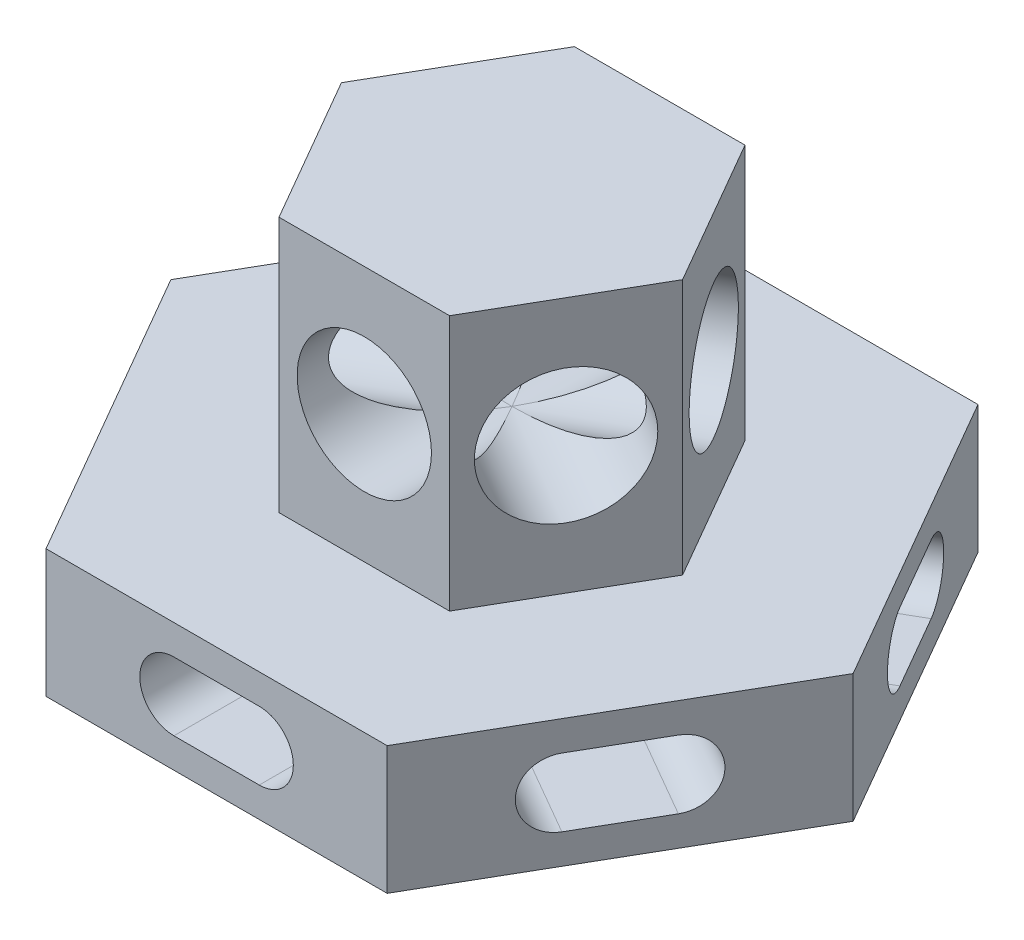
ISO-10303-21;
HEADER;
FILE_DESCRIPTION(('STEP AP214'),'2;1');
FILE_NAME('part.step','',(''),(''),'','','');
FILE_SCHEMA(('AUTOMOTIVE_DESIGN { 1 0 10303 214 1 1 1 1 }'));
ENDSEC;
DATA;
#1=APPLICATION_CONTEXT('core data for automotive mechanical design processes');
#2=APPLICATION_PROTOCOL_DEFINITION('international standard','automotive_design',2000,#1);
#3=PRODUCT_CONTEXT('',#1,'mechanical');
#4=PRODUCT('Part','Part','',(#3));
#5=PRODUCT_RELATED_PRODUCT_CATEGORY('part','',(#4));
#6=PRODUCT_DEFINITION_FORMATION('','',#4);
#7=PRODUCT_DEFINITION_CONTEXT('part definition',#1,'design');
#8=PRODUCT_DEFINITION('design','',#6,#7);
#9=PRODUCT_DEFINITION_SHAPE('','',#8);
#10=(LENGTH_UNIT() NAMED_UNIT(*) SI_UNIT(.MILLI.,.METRE.));
#11=(NAMED_UNIT(*) PLANE_ANGLE_UNIT() SI_UNIT($,.RADIAN.));
#12=(NAMED_UNIT(*) SI_UNIT($,.STERADIAN.) SOLID_ANGLE_UNIT());
#13=UNCERTAINTY_MEASURE_WITH_UNIT(LENGTH_MEASURE(1.E-05),#10,'distance_accuracy_value','');
#14=(GEOMETRIC_REPRESENTATION_CONTEXT(3) GLOBAL_UNCERTAINTY_ASSIGNED_CONTEXT((#13)) GLOBAL_UNIT_ASSIGNED_CONTEXT((#10,
#11,#12)) REPRESENTATION_CONTEXT('',''));
#15=CARTESIAN_POINT('',(0.,0.,0.));
#16=DIRECTION('',(0.,0.,1.));
#17=DIRECTION('',(1.,0.,0.));
#18=AXIS2_PLACEMENT_3D('',#15,#16,#17);
#19=CARTESIAN_POINT('',(-10.,15.,-69.2820323027551));
#20=DIRECTION('',(0.,0.,1.));
#21=DIRECTION('',(1.,0.,0.));
#22=AXIS2_PLACEMENT_3D('',#19,#20,#21);
#23=CYLINDRICAL_SURFACE('',#22,8.);
#24=DIRECTION('',(0.,0.,1.));
#25=VECTOR('',#24,1.);
#26=CARTESIAN_POINT('',(-10.,23.,-69.2820323027551));
#27=LINE('',#26,#25);
#28=CARTESIAN_POINT('',(-10.,23.,-69.2820323027551));
#29=VERTEX_POINT('',#28);
#30=CARTESIAN_POINT('',(-10.,23.,-17.3205080756886));
#31=VERTEX_POINT('',#30);
#32=EDGE_CURVE('E92',#29,#31,#27,.T.);
#33=ORIENTED_EDGE('',*,*,#32,.T.);
#34=CARTESIAN_POINT('',(-10.,15.,-17.3205080756886));
#35=DIRECTION('',(0.866025403784436,0.,-0.500000000000004));
#36=DIRECTION('',(-0.500000000000004,0.,-0.866025403784436));
#37=AXIS2_PLACEMENT_3D('',#34,#35,#36);
#38=ELLIPSE('',#37,15.9999999999999,8.);
#39=CARTESIAN_POINT('',(-9.99999999999994,7.,-17.3205080756887));
#40=VERTEX_POINT('',#39);
#41=EDGE_CURVE('E457',#31,#40,#38,.F.);
#42=ORIENTED_EDGE('',*,*,#41,.T.);
#43=DIRECTION('',(0.,0.,1.));
#44=VECTOR('',#43,1.);
#45=CARTESIAN_POINT('',(-10.,7.,-69.2820323027551));
#46=LINE('',#45,#44);
#47=CARTESIAN_POINT('',(-10.,7.,-69.2820323027551));
#48=VERTEX_POINT('',#47);
#49=EDGE_CURVE('E136',#48,#40,#46,.T.);
#50=ORIENTED_EDGE('',*,*,#49,.F.);
#51=CARTESIAN_POINT('',(-10.,15.,-69.2820323027551));
#52=DIRECTION('',(0.,0.,1.));
#53=DIRECTION('',(1.,0.,0.));
#54=AXIS2_PLACEMENT_3D('',#51,#52,#53);
#55=CIRCLE('',#54,8.);
#56=EDGE_CURVE('E152',#29,#48,#55,.T.);
#57=ORIENTED_EDGE('',*,*,#56,.F.);
#58=EDGE_LOOP('',(#33,#42,#50,#57));
#59=FACE_BOUND('',#58,.T.);
#60=ADVANCED_FACE('F45',(#59),#23,.F.);
#61=CARTESIAN_POINT('',(10.,15.,-69.2820323027551));
#62=DIRECTION('',(0.,0.,1.));
#63=DIRECTION('',(1.,0.,0.));
#64=AXIS2_PLACEMENT_3D('',#61,#62,#63);
#65=CYLINDRICAL_SURFACE('',#64,8.);
#66=DIRECTION('',(0.,0.,1.));
#67=VECTOR('',#66,1.);
#68=CARTESIAN_POINT('',(10.,23.,-69.2820323027551));
#69=LINE('',#68,#67);
#70=CARTESIAN_POINT('',(10.,23.,17.3205080756886));
#71=VERTEX_POINT('',#70);
#72=CARTESIAN_POINT('',(10.,23.,69.2820323027551));
#73=VERTEX_POINT('',#72);
#74=EDGE_CURVE('E199',#71,#73,#69,.T.);
#75=ORIENTED_EDGE('',*,*,#74,.F.);
#76=CARTESIAN_POINT('',(9.99999999999999,15.,17.3205080756886));
#77=DIRECTION('',(0.866025403784436,0.,-0.500000000000004));
#78=DIRECTION('',(-0.500000000000004,0.,-0.866025403784436));
#79=AXIS2_PLACEMENT_3D('',#76,#77,#78);
#80=ELLIPSE('',#79,15.9999999999999,8.);
#81=CARTESIAN_POINT('',(9.99999999999994,7.,17.3205080756887));
#82=VERTEX_POINT('',#81);
#83=EDGE_CURVE('E690',#71,#82,#80,.T.);
#84=ORIENTED_EDGE('',*,*,#83,.T.);
#85=DIRECTION('',(0.,0.,1.));
#86=VECTOR('',#85,1.);
#87=CARTESIAN_POINT('',(10.,7.,-69.2820323027551));
#88=LINE('',#87,#86);
#89=CARTESIAN_POINT('',(10.,7.,69.2820323027551));
#90=VERTEX_POINT('',#89);
#91=EDGE_CURVE('E100',#82,#90,#88,.T.);
#92=ORIENTED_EDGE('',*,*,#91,.T.);
#93=CARTESIAN_POINT('',(10.,15.,69.2820323027551));
#94=DIRECTION('',(0.,0.,1.));
#95=DIRECTION('',(1.,0.,0.));
#96=AXIS2_PLACEMENT_3D('',#93,#94,#95);
#97=CIRCLE('',#96,8.);
#98=EDGE_CURVE('E408',#90,#73,#97,.T.);
#99=ORIENTED_EDGE('',*,*,#98,.T.);
#100=EDGE_LOOP('',(#75,#84,#92,#99));
#101=FACE_BOUND('',#100,.T.);
#102=ADVANCED_FACE('F639',(#101),#65,.F.);
#103=CARTESIAN_POINT('',(0.,60.,34.6410161513775));
#104=DIRECTION('',(0.,0.,1.));
#105=DIRECTION('',(1.,0.,0.));
#106=AXIS2_PLACEMENT_3D('',#103,#104,#105);
#107=CYLINDRICAL_SURFACE('',#106,15.75);
#108=CARTESIAN_POINT('',(0.,60.,34.6410161513775));
#109=DIRECTION('',(0.,0.,1.));
#110=DIRECTION('',(1.,0.,0.));
#111=AXIS2_PLACEMENT_3D('',#108,#109,#110);
#112=CIRCLE('',#111,15.75);
#113=CARTESIAN_POINT('',(15.75,60.,34.6410161513775));
#114=VERTEX_POINT('',#113);
#115=EDGE_CURVE('E240',#114,#114,#112,.T.);
#116=ORIENTED_EDGE('',*,*,#115,.T.);
#117=EDGE_LOOP('',(#116));
#118=FACE_BOUND('',#117,.T.);
#119=CARTESIAN_POINT('',(0.,60.,0.));
#120=DIRECTION('',(-0.866025403784438,0.,0.500000000000001));
#121=DIRECTION('',(0.500000000000001,0.,0.866025403784438));
#122=AXIS2_PLACEMENT_3D('',#119,#120,#121);
#123=ELLIPSE('',#122,31.5,15.75);
#124=CARTESIAN_POINT('',(0.,75.75,0.));
#125=VERTEX_POINT('',#124);
#126=CARTESIAN_POINT('',(0.,44.25,0.));
#127=VERTEX_POINT('',#126);
#128=EDGE_CURVE('E392',#125,#127,#123,.F.);
#129=ORIENTED_EDGE('',*,*,#128,.T.);
#130=CARTESIAN_POINT('',(0.,60.,0.));
#131=DIRECTION('',(0.86602540378444,0.,0.499999999999998));
#132=DIRECTION('',(-0.499999999999998,0.,0.86602540378444));
#133=AXIS2_PLACEMENT_3D('',#130,#131,#132);
#134=ELLIPSE('',#133,31.5000000000001,15.75);
#135=EDGE_CURVE('E224',#127,#125,#134,.F.);
#136=ORIENTED_EDGE('',*,*,#135,.T.);
#137=EDGE_LOOP('',(#129,#136));
#138=FACE_BOUND('',#137,.T.);
#139=ADVANCED_FACE('F571',(#118,#138),#107,.F.);
#140=CARTESIAN_POINT('',(-40.,30.,69.2820323027551));
#141=DIRECTION('',(0.,0.,-1.));
#142=DIRECTION('',(-1.,0.,0.));
#143=AXIS2_PLACEMENT_3D('',#140,#141,#142);
#144=PLANE('',#143);
#145=DIRECTION('',(1.,0.,0.));
#146=VECTOR('',#145,1.);
#147=CARTESIAN_POINT('',(-10.,7.,69.2820323027551));
#148=LINE('',#147,#146);
#149=CARTESIAN_POINT('',(-10.,7.,69.2820323027551));
#150=VERTEX_POINT('',#149);
#151=EDGE_CURVE('E405',#150,#90,#148,.T.);
#152=ORIENTED_EDGE('',*,*,#151,.F.);
#153=CARTESIAN_POINT('',(-10.,15.,69.2820323027551));
#154=DIRECTION('',(0.,0.,1.));
#155=DIRECTION('',(1.,0.,0.));
#156=AXIS2_PLACEMENT_3D('',#153,#154,#155);
#157=CIRCLE('',#156,8.);
#158=CARTESIAN_POINT('',(-10.,23.,69.2820323027551));
#159=VERTEX_POINT('',#158);
#160=EDGE_CURVE('E216',#159,#150,#157,.T.);
#161=ORIENTED_EDGE('',*,*,#160,.F.);
#162=DIRECTION('',(1.,0.,0.));
#163=VECTOR('',#162,1.);
#164=CARTESIAN_POINT('',(-10.,23.,69.2820323027551));
#165=LINE('',#164,#163);
#166=EDGE_CURVE('E411',#73,#159,#165,.F.);
#167=ORIENTED_EDGE('',*,*,#166,.F.);
#168=ORIENTED_EDGE('',*,*,#98,.F.);
#169=EDGE_LOOP('',(#152,#161,#167,#168));
#170=FACE_BOUND('',#169,.T.);
#171=DIRECTION('',(1.,0.,0.));
#172=VECTOR('',#171,1.);
#173=CARTESIAN_POINT('',(-40.,0.,69.2820323027551));
#174=LINE('',#173,#172);
#175=CARTESIAN_POINT('',(-40.,0.,69.2820323027551));
#176=VERTEX_POINT('',#175);
#177=CARTESIAN_POINT('',(40.,0.,69.2820323027551));
#178=VERTEX_POINT('',#177);
#179=EDGE_CURVE('E320',#176,#178,#174,.T.);
#180=ORIENTED_EDGE('',*,*,#179,.T.);
#181=DIRECTION('',(0.,-1.,0.));
#182=VECTOR('',#181,1.);
#183=CARTESIAN_POINT('',(40.,30.,69.2820323027551));
#184=LINE('',#183,#182);
#185=CARTESIAN_POINT('',(40.,30.,69.2820323027551));
#186=VERTEX_POINT('',#185);
#187=EDGE_CURVE('E388',#186,#178,#184,.T.);
#188=ORIENTED_EDGE('',*,*,#187,.F.);
#189=DIRECTION('',(1.,0.,0.));
#190=VECTOR('',#189,1.);
#191=CARTESIAN_POINT('',(-40.,30.,69.2820323027551));
#192=LINE('',#191,#190);
#193=CARTESIAN_POINT('',(-40.,30.,69.2820323027551));
#194=VERTEX_POINT('',#193);
#195=EDGE_CURVE('E321',#194,#186,#192,.T.);
#196=ORIENTED_EDGE('',*,*,#195,.F.);
#197=DIRECTION('',(0.,-1.,0.));
#198=VECTOR('',#197,1.);
#199=CARTESIAN_POINT('',(-40.,30.,69.2820323027551));
#200=LINE('',#199,#198);
#201=EDGE_CURVE('E346',#194,#176,#200,.T.);
#202=ORIENTED_EDGE('',*,*,#201,.T.);
#203=EDGE_LOOP('',(#180,#188,#196,#202));
#204=FACE_BOUND('',#203,.T.);
#205=ADVANCED_FACE('F47',(#170,#204),#144,.F.);
#206=CARTESIAN_POINT('',(40.,30.,69.2820323027551));
#207=DIRECTION('',(-0.866025403784439,0.,-0.5));
#208=DIRECTION('',(-0.5,0.,0.866025403784439));
#209=AXIS2_PLACEMENT_3D('',#206,#207,#208);
#210=PLANE('',#209);
#211=CARTESIAN_POINT('',(55.0000000000001,15.,43.3012701892218));
#212=DIRECTION('',(-0.866025403784439,0.,-0.5));
#213=DIRECTION('',(-0.5,0.,0.866025403784439));
#214=AXIS2_PLACEMENT_3D('',#211,#212,#213);
#215=CIRCLE('',#214,8.);
#216=CARTESIAN_POINT('',(55.,7.,43.3012701892218));
#217=VERTEX_POINT('',#216);
#218=CARTESIAN_POINT('',(55.,23.,43.3012701892218));
#219=VERTEX_POINT('',#218);
#220=EDGE_CURVE('E192',#217,#219,#215,.T.);
#221=ORIENTED_EDGE('',*,*,#220,.T.);
#222=DIRECTION('',(0.5,0.,-0.866025403784439));
#223=VECTOR('',#222,1.);
#224=CARTESIAN_POINT('',(40.,23.,69.2820323027551));
#225=LINE('',#224,#223);
#226=CARTESIAN_POINT('',(65.0000000000001,23.,25.980762113533));
#227=VERTEX_POINT('',#226);
#228=EDGE_CURVE('E188',#219,#227,#225,.T.);
#229=ORIENTED_EDGE('',*,*,#228,.T.);
#230=CARTESIAN_POINT('',(65.,15.,25.980762113533));
#231=DIRECTION('',(-0.866025403784439,0.,-0.5));
#232=DIRECTION('',(-0.5,0.,0.866025403784439));
#233=AXIS2_PLACEMENT_3D('',#230,#231,#232);
#234=CIRCLE('',#233,8.);
#235=CARTESIAN_POINT('',(65.0000000000001,7.,25.980762113533));
#236=VERTEX_POINT('',#235);
#237=EDGE_CURVE('E11',#227,#236,#234,.T.);
#238=ORIENTED_EDGE('',*,*,#237,.T.);
#239=DIRECTION('',(-0.5,0.,0.866025403784439));
#240=VECTOR('',#239,1.);
#241=CARTESIAN_POINT('',(40.,7.,69.2820323027551));
#242=LINE('',#241,#240);
#243=EDGE_CURVE('E167',#236,#217,#242,.T.);
#244=ORIENTED_EDGE('',*,*,#243,.T.);
#245=EDGE_LOOP('',(#221,#229,#238,#244));
#246=FACE_BOUND('',#245,.T.);
#247=DIRECTION('',(0.5,0.,-0.866025403784439));
#248=VECTOR('',#247,1.);
#249=CARTESIAN_POINT('',(40.,0.,69.2820323027551));
#250=LINE('',#249,#248);
#251=CARTESIAN_POINT('',(80.,0.,0.));
#252=VERTEX_POINT('',#251);
#253=EDGE_CURVE('E350',#178,#252,#250,.T.);
#254=ORIENTED_EDGE('',*,*,#253,.T.);
#255=DIRECTION('',(0.,-1.,0.));
#256=VECTOR('',#255,1.);
#257=CARTESIAN_POINT('',(80.,30.,0.));
#258=LINE('',#257,#256);
#259=CARTESIAN_POINT('',(80.,30.,0.));
#260=VERTEX_POINT('',#259);
#261=EDGE_CURVE('E384',#260,#252,#258,.T.);
#262=ORIENTED_EDGE('',*,*,#261,.F.);
#263=DIRECTION('',(0.5,0.,-0.866025403784439));
#264=VECTOR('',#263,1.);
#265=CARTESIAN_POINT('',(40.,30.,69.2820323027551));
#266=LINE('',#265,#264);
#267=EDGE_CURVE('E325',#186,#260,#266,.T.);
#268=ORIENTED_EDGE('',*,*,#267,.F.);
#269=ORIENTED_EDGE('',*,*,#187,.T.);
#270=EDGE_LOOP('',(#254,#262,#268,#269));
#271=FACE_BOUND('',#270,.T.);
#272=ADVANCED_FACE('F742',(#246,#271),#210,.F.);
#273=CARTESIAN_POINT('',(80.,30.,0.));
#274=DIRECTION('',(-0.866025403784439,0.,0.5));
#275=DIRECTION('',(0.5,0.,0.866025403784439));
#276=AXIS2_PLACEMENT_3D('',#273,#274,#275);
#277=PLANE('',#276);
#278=DIRECTION('',(-0.5,0.,-0.866025403784439));
#279=VECTOR('',#278,1.);
#280=CARTESIAN_POINT('',(80.,23.,0.));
#281=LINE('',#280,#279);
#282=CARTESIAN_POINT('',(64.9999999999998,23.,-25.9807621135334));
#283=VERTEX_POINT('',#282);
#284=CARTESIAN_POINT('',(54.9999999999998,23.,-43.3012701892222));
#285=VERTEX_POINT('',#284);
#286=EDGE_CURVE('E184',#283,#285,#281,.T.);
#287=ORIENTED_EDGE('',*,*,#286,.T.);
#288=CARTESIAN_POINT('',(54.9999999999998,15.,-43.3012701892222));
#289=DIRECTION('',(-0.866025403784439,0.,0.5));
#290=DIRECTION('',(0.5,0.,0.866025403784439));
#291=AXIS2_PLACEMENT_3D('',#288,#289,#290);
#292=CIRCLE('',#291,8.);
#293=CARTESIAN_POINT('',(54.9999999999998,7.,-43.3012701892222));
#294=VERTEX_POINT('',#293);
#295=EDGE_CURVE('E170',#285,#294,#292,.T.);
#296=ORIENTED_EDGE('',*,*,#295,.T.);
#297=DIRECTION('',(0.5,0.,0.866025403784439));
#298=VECTOR('',#297,1.);
#299=CARTESIAN_POINT('',(80.,7.,0.));
#300=LINE('',#299,#298);
#301=CARTESIAN_POINT('',(64.9999999999998,7.,-25.9807621135334));
#302=VERTEX_POINT('',#301);
#303=EDGE_CURVE('E161',#294,#302,#300,.T.);
#304=ORIENTED_EDGE('',*,*,#303,.T.);
#305=CARTESIAN_POINT('',(64.9999999999998,15.,-25.9807621135334));
#306=DIRECTION('',(-0.866025403784439,0.,0.5));
#307=DIRECTION('',(0.5,0.,0.866025403784439));
#308=AXIS2_PLACEMENT_3D('',#305,#306,#307);
#309=CIRCLE('',#308,8.);
#310=EDGE_CURVE('E56',#302,#283,#309,.T.);
#311=ORIENTED_EDGE('',*,*,#310,.T.);
#312=EDGE_LOOP('',(#287,#296,#304,#311));
#313=FACE_BOUND('',#312,.T.);
#314=DIRECTION('',(-0.5,0.,-0.866025403784439));
#315=VECTOR('',#314,1.);
#316=CARTESIAN_POINT('',(80.,0.,0.));
#317=LINE('',#316,#315);
#318=CARTESIAN_POINT('',(40.,0.,-69.2820323027551));
#319=VERTEX_POINT('',#318);
#320=EDGE_CURVE('E354',#252,#319,#317,.T.);
#321=ORIENTED_EDGE('',*,*,#320,.T.);
#322=DIRECTION('',(0.,-1.,0.));
#323=VECTOR('',#322,1.);
#324=CARTESIAN_POINT('',(40.,30.,-69.2820323027551));
#325=LINE('',#324,#323);
#326=CARTESIAN_POINT('',(40.,30.,-69.2820323027551));
#327=VERTEX_POINT('',#326);
#328=EDGE_CURVE('E380',#327,#319,#325,.T.);
#329=ORIENTED_EDGE('',*,*,#328,.F.);
#330=DIRECTION('',(-0.5,0.,-0.866025403784439));
#331=VECTOR('',#330,1.);
#332=CARTESIAN_POINT('',(80.,30.,0.));
#333=LINE('',#332,#331);
#334=EDGE_CURVE('E330',#260,#327,#333,.T.);
#335=ORIENTED_EDGE('',*,*,#334,.F.);
#336=ORIENTED_EDGE('',*,*,#261,.T.);
#337=EDGE_LOOP('',(#321,#329,#335,#336));
#338=FACE_BOUND('',#337,.T.);
#339=ADVANCED_FACE('F715',(#313,#338),#277,.F.);
#340=CARTESIAN_POINT('',(40.,30.,-69.2820323027551));
#341=DIRECTION('',(0.,0.,1.));
#342=DIRECTION('',(1.,0.,0.));
#343=AXIS2_PLACEMENT_3D('',#340,#341,#342);
#344=PLANE('',#343);
#345=DIRECTION('',(1.,0.,0.));
#346=VECTOR('',#345,1.);
#347=CARTESIAN_POINT('',(40.,23.,-69.2820323027551));
#348=LINE('',#347,#346);
#349=CARTESIAN_POINT('',(10.,23.,-69.2820323027551));
#350=VERTEX_POINT('',#349);
#351=EDGE_CURVE('E49',#350,#29,#348,.F.);
#352=ORIENTED_EDGE('',*,*,#351,.T.);
#353=ORIENTED_EDGE('',*,*,#56,.T.);
#354=DIRECTION('',(1.,0.,0.));
#355=VECTOR('',#354,1.);
#356=CARTESIAN_POINT('',(40.,7.,-69.2820323027551));
#357=LINE('',#356,#355);
#358=CARTESIAN_POINT('',(10.,7.,-69.2820323027551));
#359=VERTEX_POINT('',#358);
#360=EDGE_CURVE('E429',#48,#359,#357,.T.);
#361=ORIENTED_EDGE('',*,*,#360,.T.);
#362=CARTESIAN_POINT('',(10.,15.,-69.2820323027551));
#363=DIRECTION('',(0.,0.,1.));
#364=DIRECTION('',(1.,0.,0.));
#365=AXIS2_PLACEMENT_3D('',#362,#363,#364);
#366=CIRCLE('',#365,8.);
#367=EDGE_CURVE('E430',#359,#350,#366,.T.);
#368=ORIENTED_EDGE('',*,*,#367,.T.);
#369=EDGE_LOOP('',(#352,#353,#361,#368));
#370=FACE_BOUND('',#369,.T.);
#371=DIRECTION('',(-1.,0.,0.));
#372=VECTOR('',#371,1.);
#373=CARTESIAN_POINT('',(40.,0.,-69.2820323027551));
#374=LINE('',#373,#372);
#375=CARTESIAN_POINT('',(-40.,0.,-69.2820323027551));
#376=VERTEX_POINT('',#375);
#377=EDGE_CURVE('E358',#319,#376,#374,.T.);
#378=ORIENTED_EDGE('',*,*,#377,.T.);
#379=DIRECTION('',(0.,-1.,0.));
#380=VECTOR('',#379,1.);
#381=CARTESIAN_POINT('',(-40.,30.,-69.2820323027551));
#382=LINE('',#381,#380);
#383=CARTESIAN_POINT('',(-40.,30.,-69.2820323027551));
#384=VERTEX_POINT('',#383);
#385=EDGE_CURVE('E376',#384,#376,#382,.T.);
#386=ORIENTED_EDGE('',*,*,#385,.F.);
#387=DIRECTION('',(-1.,0.,0.));
#388=VECTOR('',#387,1.);
#389=CARTESIAN_POINT('',(40.,30.,-69.2820323027551));
#390=LINE('',#389,#388);
#391=EDGE_CURVE('E334',#327,#384,#390,.T.);
#392=ORIENTED_EDGE('',*,*,#391,.F.);
#393=ORIENTED_EDGE('',*,*,#328,.T.);
#394=EDGE_LOOP('',(#378,#386,#392,#393));
#395=FACE_BOUND('',#394,.T.);
#396=ADVANCED_FACE('F437',(#370,#395),#344,.F.);
#397=CARTESIAN_POINT('',(-40.,30.,-69.2820323027551));
#398=DIRECTION('',(0.866025403784438,0.,0.5));
#399=DIRECTION('',(0.5,0.,-0.866025403784439));
#400=AXIS2_PLACEMENT_3D('',#397,#398,#399);
#401=PLANE('',#400);
#402=DIRECTION('',(-0.5,0.,0.866025403784439));
#403=VECTOR('',#402,1.);
#404=CARTESIAN_POINT('',(-40.,23.,-69.2820323027551));
#405=LINE('',#404,#403);
#406=CARTESIAN_POINT('',(-55.,23.,-43.3012701892218));
#407=VERTEX_POINT('',#406);
#408=CARTESIAN_POINT('',(-65.0000000000001,23.,-25.980762113533));
#409=VERTEX_POINT('',#408);
#410=EDGE_CURVE('E181',#407,#409,#405,.T.);
#411=ORIENTED_EDGE('',*,*,#410,.T.);
#412=CARTESIAN_POINT('',(-65.0000000000001,15.,-25.980762113533));
#413=DIRECTION('',(0.866025403784438,0.,0.5));
#414=DIRECTION('',(0.5,0.,-0.866025403784439));
#415=AXIS2_PLACEMENT_3D('',#412,#413,#414);
#416=CIRCLE('',#415,8.);
#417=CARTESIAN_POINT('',(-65.0000000000001,7.,-25.980762113533));
#418=VERTEX_POINT('',#417);
#419=EDGE_CURVE('E159',#409,#418,#416,.T.);
#420=ORIENTED_EDGE('',*,*,#419,.T.);
#421=DIRECTION('',(0.5,0.,-0.866025403784439));
#422=VECTOR('',#421,1.);
#423=CARTESIAN_POINT('',(-40.,7.,-69.2820323027551));
#424=LINE('',#423,#422);
#425=CARTESIAN_POINT('',(-55.0000000000001,7.,-43.3012701892218));
#426=VERTEX_POINT('',#425);
#427=EDGE_CURVE('E132',#418,#426,#424,.T.);
#428=ORIENTED_EDGE('',*,*,#427,.T.);
#429=CARTESIAN_POINT('',(-55.0000000000001,15.,-43.3012701892218));
#430=DIRECTION('',(0.866025403784438,0.,0.5));
#431=DIRECTION('',(0.5,0.,-0.866025403784439));
#432=AXIS2_PLACEMENT_3D('',#429,#430,#431);
#433=CIRCLE('',#432,8.);
#434=EDGE_CURVE('E146',#426,#407,#433,.T.);
#435=ORIENTED_EDGE('',*,*,#434,.T.);
#436=EDGE_LOOP('',(#411,#420,#428,#435));
#437=FACE_BOUND('',#436,.T.);
#438=DIRECTION('',(-0.5,0.,0.866025403784439));
#439=VECTOR('',#438,1.);
#440=CARTESIAN_POINT('',(-40.,0.,-69.2820323027551));
#441=LINE('',#440,#439);
#442=CARTESIAN_POINT('',(-80.,0.,0.));
#443=VERTEX_POINT('',#442);
#444=EDGE_CURVE('E362',#376,#443,#441,.T.);
#445=ORIENTED_EDGE('',*,*,#444,.T.);
#446=DIRECTION('',(0.,-1.,0.));
#447=VECTOR('',#446,1.);
#448=CARTESIAN_POINT('',(-80.,30.,0.));
#449=LINE('',#448,#447);
#450=CARTESIAN_POINT('',(-80.,30.,0.));
#451=VERTEX_POINT('',#450);
#452=EDGE_CURVE('E372',#451,#443,#449,.T.);
#453=ORIENTED_EDGE('',*,*,#452,.F.);
#454=DIRECTION('',(-0.5,0.,0.866025403784439));
#455=VECTOR('',#454,1.);
#456=CARTESIAN_POINT('',(-40.,30.,-69.2820323027551));
#457=LINE('',#456,#455);
#458=EDGE_CURVE('E338',#384,#451,#457,.T.);
#459=ORIENTED_EDGE('',*,*,#458,.F.);
#460=ORIENTED_EDGE('',*,*,#385,.T.);
#461=EDGE_LOOP('',(#445,#453,#459,#460));
#462=FACE_BOUND('',#461,.T.);
#463=ADVANCED_FACE('F156',(#437,#462),#401,.F.);
#464=CARTESIAN_POINT('',(-80.,30.,0.));
#465=DIRECTION('',(0.866025403784439,0.,-0.5));
#466=DIRECTION('',(-0.5,0.,-0.866025403784439));
#467=AXIS2_PLACEMENT_3D('',#464,#465,#466);
#468=PLANE('',#467);
#469=DIRECTION('',(0.5,0.,0.866025403784439));
#470=VECTOR('',#469,1.);
#471=CARTESIAN_POINT('',(-80.,23.,0.));
#472=LINE('',#471,#470);
#473=CARTESIAN_POINT('',(-64.9999999999998,23.,25.9807621135334));
#474=VERTEX_POINT('',#473);
#475=CARTESIAN_POINT('',(-54.9999999999998,23.,43.3012701892222));
#476=VERTEX_POINT('',#475);
#477=EDGE_CURVE('E177',#474,#476,#472,.T.);
#478=ORIENTED_EDGE('',*,*,#477,.T.);
#479=CARTESIAN_POINT('',(-54.9999999999998,15.,43.3012701892222));
#480=DIRECTION('',(0.866025403784439,0.,-0.5));
#481=DIRECTION('',(-0.5,0.,-0.866025403784439));
#482=AXIS2_PLACEMENT_3D('',#479,#480,#481);
#483=CIRCLE('',#482,8.);
#484=CARTESIAN_POINT('',(-54.9999999999998,7.,43.3012701892222));
#485=VERTEX_POINT('',#484);
#486=EDGE_CURVE('E153',#476,#485,#483,.T.);
#487=ORIENTED_EDGE('',*,*,#486,.T.);
#488=DIRECTION('',(-0.5,0.,-0.866025403784439));
#489=VECTOR('',#488,1.);
#490=CARTESIAN_POINT('',(-80.,7.,0.));
#491=LINE('',#490,#489);
#492=CARTESIAN_POINT('',(-64.9999999999998,7.,25.9807621135334));
#493=VERTEX_POINT('',#492);
#494=EDGE_CURVE('E162',#485,#493,#491,.T.);
#495=ORIENTED_EDGE('',*,*,#494,.T.);
#496=CARTESIAN_POINT('',(-64.9999999999998,15.,25.9807621135334));
#497=DIRECTION('',(0.866025403784439,0.,-0.5));
#498=DIRECTION('',(-0.5,0.,-0.866025403784439));
#499=AXIS2_PLACEMENT_3D('',#496,#497,#498);
#500=CIRCLE('',#499,8.);
#501=EDGE_CURVE('E404',#493,#474,#500,.T.);
#502=ORIENTED_EDGE('',*,*,#501,.T.);
#503=EDGE_LOOP('',(#478,#487,#495,#502));
#504=FACE_BOUND('',#503,.T.);
#505=DIRECTION('',(0.5,0.,0.866025403784439));
#506=VECTOR('',#505,1.);
#507=CARTESIAN_POINT('',(-80.,0.,0.));
#508=LINE('',#507,#506);
#509=EDGE_CURVE('E326',#443,#176,#508,.T.);
#510=ORIENTED_EDGE('',*,*,#509,.T.);
#511=ORIENTED_EDGE('',*,*,#201,.F.);
#512=DIRECTION('',(0.5,0.,0.866025403784439));
#513=VECTOR('',#512,1.);
#514=CARTESIAN_POINT('',(-80.,30.,0.));
#515=LINE('',#514,#513);
#516=EDGE_CURVE('E342',#451,#194,#515,.T.);
#517=ORIENTED_EDGE('',*,*,#516,.F.);
#518=ORIENTED_EDGE('',*,*,#452,.T.);
#519=EDGE_LOOP('',(#510,#511,#517,#518));
#520=FACE_BOUND('',#519,.T.);
#521=ADVANCED_FACE('F961',(#504,#520),#468,.F.);
#522=CARTESIAN_POINT('',(0.,30.,0.));
#523=DIRECTION('',(0.,1.,0.));
#524=DIRECTION('',(0.,0.,1.));
#525=AXIS2_PLACEMENT_3D('',#522,#523,#524);
#526=PLANE('',#525);
#527=DIRECTION('',(1.,0.,0.));
#528=VECTOR('',#527,1.);
#529=CARTESIAN_POINT('',(-20.,30.,34.6410161513775));
#530=LINE('',#529,#528);
#531=CARTESIAN_POINT('',(-20.,30.,34.6410161513775));
#532=VERTEX_POINT('',#531);
#533=CARTESIAN_POINT('',(20.,30.,34.6410161513776));
#534=VERTEX_POINT('',#533);
#535=EDGE_CURVE('E248',#532,#534,#530,.T.);
#536=ORIENTED_EDGE('',*,*,#535,.F.);
#537=DIRECTION('',(0.5,0.,0.866025403784439));
#538=VECTOR('',#537,1.);
#539=CARTESIAN_POINT('',(-40.,30.,0.));
#540=LINE('',#539,#538);
#541=CARTESIAN_POINT('',(-40.,30.,0.));
#542=VERTEX_POINT('',#541);
#543=EDGE_CURVE('E254',#542,#532,#540,.T.);
#544=ORIENTED_EDGE('',*,*,#543,.F.);
#545=DIRECTION('',(-0.5,0.,0.866025403784439));
#546=VECTOR('',#545,1.);
#547=CARTESIAN_POINT('',(-20.,30.,-34.6410161513775));
#548=LINE('',#547,#546);
#549=CARTESIAN_POINT('',(-20.,30.,-34.6410161513775));
#550=VERTEX_POINT('',#549);
#551=EDGE_CURVE('E290',#550,#542,#548,.T.);
#552=ORIENTED_EDGE('',*,*,#551,.F.);
#553=DIRECTION('',(-1.,0.,0.));
#554=VECTOR('',#553,1.);
#555=CARTESIAN_POINT('',(20.,30.,-34.6410161513775));
#556=LINE('',#555,#554);
#557=CARTESIAN_POINT('',(20.,30.,-34.6410161513775));
#558=VERTEX_POINT('',#557);
#559=EDGE_CURVE('E286',#558,#550,#556,.T.);
#560=ORIENTED_EDGE('',*,*,#559,.F.);
#561=DIRECTION('',(-0.499999999999999,0.,-0.866025403784439));
#562=VECTOR('',#561,1.);
#563=CARTESIAN_POINT('',(40.,30.,0.));
#564=LINE('',#563,#562);
#565=CARTESIAN_POINT('',(40.,30.,0.));
#566=VERTEX_POINT('',#565);
#567=EDGE_CURVE('E282',#566,#558,#564,.T.);
#568=ORIENTED_EDGE('',*,*,#567,.F.);
#569=DIRECTION('',(0.5,0.,-0.866025403784439));
#570=VECTOR('',#569,1.);
#571=CARTESIAN_POINT('',(20.,30.,34.6410161513776));
#572=LINE('',#571,#570);
#573=EDGE_CURVE('E278',#534,#566,#572,.T.);
#574=ORIENTED_EDGE('',*,*,#573,.F.);
#575=EDGE_LOOP('',(#536,#544,#552,#560,#568,#574));
#576=FACE_BOUND('',#575,.T.);
#577=ORIENTED_EDGE('',*,*,#195,.T.);
#578=ORIENTED_EDGE('',*,*,#267,.T.);
#579=ORIENTED_EDGE('',*,*,#334,.T.);
#580=ORIENTED_EDGE('',*,*,#391,.T.);
#581=ORIENTED_EDGE('',*,*,#458,.T.);
#582=ORIENTED_EDGE('',*,*,#516,.T.);
#583=EDGE_LOOP('',(#577,#578,#579,#580,#581,#582));
#584=FACE_BOUND('',#583,.T.);
#585=ADVANCED_FACE('F613',(#576,#584),#526,.T.);
#586=CARTESIAN_POINT('',(0.,0.,0.));
#587=DIRECTION('',(0.,1.,0.));
#588=DIRECTION('',(0.,0.,1.));
#589=AXIS2_PLACEMENT_3D('',#586,#587,#588);
#590=PLANE('',#589);
#591=ORIENTED_EDGE('',*,*,#179,.F.);
#592=ORIENTED_EDGE('',*,*,#509,.F.);
#593=ORIENTED_EDGE('',*,*,#444,.F.);
#594=ORIENTED_EDGE('',*,*,#377,.F.);
#595=ORIENTED_EDGE('',*,*,#320,.F.);
#596=ORIENTED_EDGE('',*,*,#253,.F.);
#597=EDGE_LOOP('',(#591,#592,#593,#594,#595,#596));
#598=FACE_BOUND('',#597,.T.);
#599=ADVANCED_FACE('F623',(#598),#590,.F.);
#600=CARTESIAN_POINT('',(-20.,90.,34.6410161513775));
#601=DIRECTION('',(0.,0.,-1.));
#602=DIRECTION('',(-1.,0.,0.));
#603=AXIS2_PLACEMENT_3D('',#600,#601,#602);
#604=PLANE('',#603);
#605=ORIENTED_EDGE('',*,*,#115,.F.);
#606=EDGE_LOOP('',(#605));
#607=FACE_BOUND('',#606,.T.);
#608=ORIENTED_EDGE('',*,*,#535,.T.);
#609=DIRECTION('',(0.,-1.,0.));
#610=VECTOR('',#609,1.);
#611=CARTESIAN_POINT('',(20.,90.,34.6410161513776));
#612=LINE('',#611,#610);
#613=CARTESIAN_POINT('',(20.,90.,34.6410161513776));
#614=VERTEX_POINT('',#613);
#615=EDGE_CURVE('E316',#614,#534,#612,.T.);
#616=ORIENTED_EDGE('',*,*,#615,.F.);
#617=DIRECTION('',(1.,0.,0.));
#618=VECTOR('',#617,1.);
#619=CARTESIAN_POINT('',(-20.,90.,34.6410161513775));
#620=LINE('',#619,#618);
#621=CARTESIAN_POINT('',(-20.,90.,34.6410161513775));
#622=VERTEX_POINT('',#621);
#623=EDGE_CURVE('E249',#622,#614,#620,.T.);
#624=ORIENTED_EDGE('',*,*,#623,.F.);
#625=DIRECTION('',(0.,-1.,0.));
#626=VECTOR('',#625,1.);
#627=CARTESIAN_POINT('',(-20.,90.,34.6410161513775));
#628=LINE('',#627,#626);
#629=EDGE_CURVE('E274',#622,#532,#628,.T.);
#630=ORIENTED_EDGE('',*,*,#629,.T.);
#631=EDGE_LOOP('',(#608,#616,#624,#630));
#632=FACE_BOUND('',#631,.T.);
#633=ADVANCED_FACE('F621',(#607,#632),#604,.F.);
#634=CARTESIAN_POINT('',(20.,90.,34.6410161513776));
#635=DIRECTION('',(-0.866025403784439,0.,-0.5));
#636=DIRECTION('',(-0.5,0.,0.866025403784439));
#637=AXIS2_PLACEMENT_3D('',#634,#635,#636);
#638=PLANE('',#637);
#639=CARTESIAN_POINT('',(30.,60.,17.3205080756887));
#640=DIRECTION('',(0.86602540378444,0.,0.499999999999998));
#641=DIRECTION('',(0.499999999999998,0.,-0.86602540378444));
#642=AXIS2_PLACEMENT_3D('',#639,#640,#641);
#643=CIRCLE('',#642,15.75);
#644=CARTESIAN_POINT('',(37.875,60.,3.68060796608376));
#645=VERTEX_POINT('',#644);
#646=EDGE_CURVE('E232',#645,#645,#643,.T.);
#647=ORIENTED_EDGE('',*,*,#646,.F.);
#648=EDGE_LOOP('',(#647));
#649=FACE_BOUND('',#648,.T.);
#650=ORIENTED_EDGE('',*,*,#573,.T.);
#651=DIRECTION('',(0.,-1.,0.));
#652=VECTOR('',#651,1.);
#653=CARTESIAN_POINT('',(40.,90.,0.));
#654=LINE('',#653,#652);
#655=CARTESIAN_POINT('',(40.,90.,0.));
#656=VERTEX_POINT('',#655);
#657=EDGE_CURVE('E312',#656,#566,#654,.T.);
#658=ORIENTED_EDGE('',*,*,#657,.F.);
#659=DIRECTION('',(0.5,0.,-0.866025403784439));
#660=VECTOR('',#659,1.);
#661=CARTESIAN_POINT('',(20.,90.,34.6410161513776));
#662=LINE('',#661,#660);
#663=EDGE_CURVE('E253',#614,#656,#662,.T.);
#664=ORIENTED_EDGE('',*,*,#663,.F.);
#665=ORIENTED_EDGE('',*,*,#615,.T.);
#666=EDGE_LOOP('',(#650,#658,#664,#665));
#667=FACE_BOUND('',#666,.T.);
#668=ADVANCED_FACE('F619',(#649,#667),#638,.F.);
#669=CARTESIAN_POINT('',(40.,90.,0.));
#670=DIRECTION('',(-0.866025403784439,0.,0.499999999999999));
#671=DIRECTION('',(0.5,0.,0.866025403784439));
#672=AXIS2_PLACEMENT_3D('',#669,#670,#671);
#673=PLANE('',#672);
#674=CARTESIAN_POINT('',(29.9999999999999,60.,-17.3205080756889));
#675=DIRECTION('',(0.866025403784436,0.,-0.500000000000004));
#676=DIRECTION('',(-0.500000000000004,0.,-0.866025403784436));
#677=AXIS2_PLACEMENT_3D('',#674,#675,#676);
#678=CIRCLE('',#677,15.75);
#679=CARTESIAN_POINT('',(22.1249999999999,60.,-30.9604081852938));
#680=VERTEX_POINT('',#679);
#681=EDGE_CURVE('E211',#680,#680,#678,.T.);
#682=ORIENTED_EDGE('',*,*,#681,.F.);
#683=EDGE_LOOP('',(#682));
#684=FACE_BOUND('',#683,.T.);
#685=ORIENTED_EDGE('',*,*,#567,.T.);
#686=DIRECTION('',(0.,-1.,0.));
#687=VECTOR('',#686,1.);
#688=CARTESIAN_POINT('',(20.,90.,-34.6410161513775));
#689=LINE('',#688,#687);
#690=CARTESIAN_POINT('',(20.,90.,-34.6410161513775));
#691=VERTEX_POINT('',#690);
#692=EDGE_CURVE('E308',#691,#558,#689,.T.);
#693=ORIENTED_EDGE('',*,*,#692,.F.);
#694=DIRECTION('',(-0.499999999999999,0.,-0.866025403784439));
#695=VECTOR('',#694,1.);
#696=CARTESIAN_POINT('',(40.,90.,0.));
#697=LINE('',#696,#695);
#698=EDGE_CURVE('E258',#656,#691,#697,.T.);
#699=ORIENTED_EDGE('',*,*,#698,.F.);
#700=ORIENTED_EDGE('',*,*,#657,.T.);
#701=EDGE_LOOP('',(#685,#693,#699,#700));
#702=FACE_BOUND('',#701,.T.);
#703=ADVANCED_FACE('F616',(#684,#702),#673,.F.);
#704=CARTESIAN_POINT('',(20.,90.,-34.6410161513775));
#705=DIRECTION('',(0.,0.,1.));
#706=DIRECTION('',(1.,0.,0.));
#707=AXIS2_PLACEMENT_3D('',#704,#705,#706);
#708=PLANE('',#707);
#709=CARTESIAN_POINT('',(0.,60.,-34.6410161513775));
#710=DIRECTION('',(0.,0.,1.));
#711=DIRECTION('',(1.,0.,0.));
#712=AXIS2_PLACEMENT_3D('',#709,#710,#711);
#713=CIRCLE('',#712,15.75);
#714=CARTESIAN_POINT('',(15.75,60.,-34.6410161513775));
#715=VERTEX_POINT('',#714);
#716=EDGE_CURVE('E244',#715,#715,#713,.T.);
#717=ORIENTED_EDGE('',*,*,#716,.T.);
#718=EDGE_LOOP('',(#717));
#719=FACE_BOUND('',#718,.T.);
#720=ORIENTED_EDGE('',*,*,#559,.T.);
#721=DIRECTION('',(0.,-1.,0.));
#722=VECTOR('',#721,1.);
#723=CARTESIAN_POINT('',(-20.,90.,-34.6410161513775));
#724=LINE('',#723,#722);
#725=CARTESIAN_POINT('',(-20.,90.,-34.6410161513775));
#726=VERTEX_POINT('',#725);
#727=EDGE_CURVE('E304',#726,#550,#724,.T.);
#728=ORIENTED_EDGE('',*,*,#727,.F.);
#729=DIRECTION('',(-1.,0.,0.));
#730=VECTOR('',#729,1.);
#731=CARTESIAN_POINT('',(20.,90.,-34.6410161513775));
#732=LINE('',#731,#730);
#733=EDGE_CURVE('E262',#691,#726,#732,.T.);
#734=ORIENTED_EDGE('',*,*,#733,.F.);
#735=ORIENTED_EDGE('',*,*,#692,.T.);
#736=EDGE_LOOP('',(#720,#728,#734,#735));
#737=FACE_BOUND('',#736,.T.);
#738=ADVANCED_FACE('F597',(#719,#737),#708,.F.);
#739=CARTESIAN_POINT('',(-20.,90.,-34.6410161513775));
#740=DIRECTION('',(0.866025403784439,0.,0.5));
#741=DIRECTION('',(0.5,0.,-0.866025403784439));
#742=AXIS2_PLACEMENT_3D('',#739,#740,#741);
#743=PLANE('',#742);
#744=CARTESIAN_POINT('',(-30.,60.,-17.3205080756887));
#745=DIRECTION('',(0.866025403784439,0.,0.5));
#746=DIRECTION('',(0.5,0.,-0.866025403784439));
#747=AXIS2_PLACEMENT_3D('',#744,#745,#746);
#748=CIRCLE('',#747,15.75);
#749=CARTESIAN_POINT('',(-22.125,60.,-30.9604081852936));
#750=VERTEX_POINT('',#749);
#751=EDGE_CURVE('E236',#750,#750,#748,.T.);
#752=ORIENTED_EDGE('',*,*,#751,.T.);
#753=EDGE_LOOP('',(#752));
#754=FACE_BOUND('',#753,.T.);
#755=ORIENTED_EDGE('',*,*,#551,.T.);
#756=DIRECTION('',(0.,-1.,0.));
#757=VECTOR('',#756,1.);
#758=CARTESIAN_POINT('',(-40.,90.,0.));
#759=LINE('',#758,#757);
#760=CARTESIAN_POINT('',(-40.,90.,0.));
#761=VERTEX_POINT('',#760);
#762=EDGE_CURVE('E300',#761,#542,#759,.T.);
#763=ORIENTED_EDGE('',*,*,#762,.F.);
#764=DIRECTION('',(-0.5,0.,0.866025403784439));
#765=VECTOR('',#764,1.);
#766=CARTESIAN_POINT('',(-20.,90.,-34.6410161513775));
#767=LINE('',#766,#765);
#768=EDGE_CURVE('E266',#726,#761,#767,.T.);
#769=ORIENTED_EDGE('',*,*,#768,.F.);
#770=ORIENTED_EDGE('',*,*,#727,.T.);
#771=EDGE_LOOP('',(#755,#763,#769,#770));
#772=FACE_BOUND('',#771,.T.);
#773=ADVANCED_FACE('F593',(#754,#772),#743,.F.);
#774=CARTESIAN_POINT('',(-40.,90.,0.));
#775=DIRECTION('',(0.866025403784439,0.,-0.5));
#776=DIRECTION('',(-0.5,0.,-0.866025403784439));
#777=AXIS2_PLACEMENT_3D('',#774,#775,#776);
#778=PLANE('',#777);
#779=CARTESIAN_POINT('',(-29.9999999999999,60.,17.3205080756889));
#780=DIRECTION('',(0.866025403784439,0.,-0.5));
#781=DIRECTION('',(-0.5,0.,-0.866025403784439));
#782=AXIS2_PLACEMENT_3D('',#779,#780,#781);
#783=CIRCLE('',#782,15.75);
#784=CARTESIAN_POINT('',(-37.8749999999999,60.,3.68060796608398));
#785=VERTEX_POINT('',#784);
#786=EDGE_CURVE('E228',#785,#785,#783,.T.);
#787=ORIENTED_EDGE('',*,*,#786,.T.);
#788=EDGE_LOOP('',(#787));
#789=FACE_BOUND('',#788,.T.);
#790=ORIENTED_EDGE('',*,*,#543,.T.);
#791=ORIENTED_EDGE('',*,*,#629,.F.);
#792=DIRECTION('',(0.5,0.,0.866025403784439));
#793=VECTOR('',#792,1.);
#794=CARTESIAN_POINT('',(-40.,90.,0.));
#795=LINE('',#794,#793);
#796=EDGE_CURVE('E270',#761,#622,#795,.T.);
#797=ORIENTED_EDGE('',*,*,#796,.F.);
#798=ORIENTED_EDGE('',*,*,#762,.T.);
#799=EDGE_LOOP('',(#790,#791,#797,#798));
#800=FACE_BOUND('',#799,.T.);
#801=ADVANCED_FACE('F596',(#789,#800),#778,.F.);
#802=CARTESIAN_POINT('',(0.,90.,0.));
#803=DIRECTION('',(0.,1.,0.));
#804=DIRECTION('',(0.,0.,1.));
#805=AXIS2_PLACEMENT_3D('',#802,#803,#804);
#806=PLANE('',#805);
#807=ORIENTED_EDGE('',*,*,#623,.T.);
#808=ORIENTED_EDGE('',*,*,#663,.T.);
#809=ORIENTED_EDGE('',*,*,#698,.T.);
#810=ORIENTED_EDGE('',*,*,#733,.T.);
#811=ORIENTED_EDGE('',*,*,#768,.T.);
#812=ORIENTED_EDGE('',*,*,#796,.T.);
#813=EDGE_LOOP('',(#807,#808,#809,#810,#811,#812));
#814=FACE_BOUND('',#813,.T.);
#815=ADVANCED_FACE('F607',(#814),#806,.T.);
#816=CARTESIAN_POINT('',(0.,60.,0.));
#817=DIRECTION('',(-0.866025403784438,0.,0.500000000000001));
#818=DIRECTION('',(0.500000000000001,0.,0.866025403784438));
#819=AXIS2_PLACEMENT_3D('',#816,#817,#818);
#820=ELLIPSE('',#819,31.5,15.75);
#821=EDGE_CURVE('E396',#125,#127,#820,.T.);
#822=ORIENTED_EDGE('',*,*,#821,.T.);
#823=CARTESIAN_POINT('',(0.,60.,0.));
#824=DIRECTION('',(0.86602540378444,0.,0.499999999999998));
#825=DIRECTION('',(-0.499999999999998,0.,0.86602540378444));
#826=AXIS2_PLACEMENT_3D('',#823,#824,#825);
#827=ELLIPSE('',#826,31.5000000000001,15.75);
#828=EDGE_CURVE('E220',#127,#125,#827,.T.);
#829=ORIENTED_EDGE('',*,*,#828,.T.);
#830=EDGE_LOOP('',(#822,#829));
#831=FACE_BOUND('',#830,.T.);
#832=ORIENTED_EDGE('',*,*,#716,.F.);
#833=EDGE_LOOP('',(#832));
#834=FACE_BOUND('',#833,.T.);
#835=ADVANCED_FACE('F584',(#831,#834),#107,.F.);
#836=CARTESIAN_POINT('',(30.,60.,17.3205080756887));
#837=DIRECTION('',(0.86602540378444,0.,0.499999999999998));
#838=DIRECTION('',(0.499999999999998,0.,-0.86602540378444));
#839=AXIS2_PLACEMENT_3D('',#836,#837,#838);
#840=CYLINDRICAL_SURFACE('',#839,15.75);
#841=ORIENTED_EDGE('',*,*,#646,.T.);
#842=EDGE_LOOP('',(#841));
#843=FACE_BOUND('',#842,.T.);
#844=ORIENTED_EDGE('',*,*,#128,.F.);
#845=CARTESIAN_POINT('',(0.,60.,0.));
#846=DIRECTION('',(0.,0.,1.));
#847=DIRECTION('',(1.,0.,0.));
#848=AXIS2_PLACEMENT_3D('',#845,#846,#847);
#849=ELLIPSE('',#848,31.5,15.75);
#850=EDGE_CURVE('E400',#125,#127,#849,.F.);
#851=ORIENTED_EDGE('',*,*,#850,.T.);
#852=EDGE_LOOP('',(#844,#851));
#853=FACE_BOUND('',#852,.T.);
#854=ADVANCED_FACE('F577',(#843,#853),#840,.F.);
#855=ORIENTED_EDGE('',*,*,#821,.F.);
#856=CARTESIAN_POINT('',(0.,60.,0.));
#857=DIRECTION('',(0.,0.,1.));
#858=DIRECTION('',(1.,0.,0.));
#859=AXIS2_PLACEMENT_3D('',#856,#857,#858);
#860=ELLIPSE('',#859,31.5,15.75);
#861=EDGE_CURVE('E215',#125,#127,#860,.T.);
#862=ORIENTED_EDGE('',*,*,#861,.T.);
#863=EDGE_LOOP('',(#855,#862));
#864=FACE_BOUND('',#863,.T.);
#865=ORIENTED_EDGE('',*,*,#751,.F.);
#866=EDGE_LOOP('',(#865));
#867=FACE_BOUND('',#866,.T.);
#868=ADVANCED_FACE('F587',(#864,#867),#840,.F.);
#869=CARTESIAN_POINT('',(29.9999999999999,60.,-17.3205080756889));
#870=DIRECTION('',(0.866025403784436,0.,-0.500000000000004));
#871=DIRECTION('',(-0.500000000000004,0.,-0.866025403784436));
#872=AXIS2_PLACEMENT_3D('',#869,#870,#871);
#873=CYLINDRICAL_SURFACE('',#872,15.75);
#874=ORIENTED_EDGE('',*,*,#681,.T.);
#875=EDGE_LOOP('',(#874));
#876=FACE_BOUND('',#875,.T.);
#877=ORIENTED_EDGE('',*,*,#850,.F.);
#878=ORIENTED_EDGE('',*,*,#828,.F.);
#879=EDGE_LOOP('',(#877,#878));
#880=FACE_BOUND('',#879,.T.);
#881=ADVANCED_FACE('F579',(#876,#880),#873,.F.);
#882=ORIENTED_EDGE('',*,*,#861,.F.);
#883=ORIENTED_EDGE('',*,*,#135,.F.);
#884=EDGE_LOOP('',(#882,#883));
#885=FACE_BOUND('',#884,.T.);
#886=ORIENTED_EDGE('',*,*,#786,.F.);
#887=EDGE_LOOP('',(#886));
#888=FACE_BOUND('',#887,.T.);
#889=ADVANCED_FACE('F582',(#885,#888),#873,.F.);
#890=CARTESIAN_POINT('',(-9.99999999999999,7.,17.3205080756889));
#891=VERTEX_POINT('',#890);
#892=EDGE_CURVE('E206',#891,#150,#46,.T.);
#893=ORIENTED_EDGE('',*,*,#892,.F.);
#894=CARTESIAN_POINT('',(-9.99999999999999,15.,17.3205080756889));
#895=DIRECTION('',(0.86602540378444,0.,0.499999999999998));
#896=DIRECTION('',(0.499999999999998,0.,-0.86602540378444));
#897=AXIS2_PLACEMENT_3D('',#894,#895,#896);
#898=ELLIPSE('',#897,16.0000000000001,8.);
#899=CARTESIAN_POINT('',(-10.,23.,17.3205080756889));
#900=VERTEX_POINT('',#899);
#901=EDGE_CURVE('E661',#900,#891,#898,.T.);
#902=ORIENTED_EDGE('',*,*,#901,.F.);
#903=EDGE_CURVE('E203',#900,#159,#27,.T.);
#904=ORIENTED_EDGE('',*,*,#903,.T.);
#905=ORIENTED_EDGE('',*,*,#160,.T.);
#906=EDGE_LOOP('',(#893,#902,#904,#905));
#907=FACE_BOUND('',#906,.T.);
#908=ADVANCED_FACE('F641',(#907),#23,.F.);
#909=CARTESIAN_POINT('',(-10.,23.,-69.2820323027551));
#910=DIRECTION('',(0.,1.,0.));
#911=DIRECTION('',(0.,0.,1.));
#912=AXIS2_PLACEMENT_3D('',#909,#910,#911);
#913=PLANE('',#912);
#914=ORIENTED_EDGE('',*,*,#32,.F.);
#915=ORIENTED_EDGE('',*,*,#351,.F.);
#916=CARTESIAN_POINT('',(10.,23.,-17.3205080756888));
#917=VERTEX_POINT('',#916);
#918=EDGE_CURVE('E85',#350,#917,#69,.T.);
#919=ORIENTED_EDGE('',*,*,#918,.T.);
#920=DIRECTION('',(0.866025403784436,0.,-0.500000000000004));
#921=VECTOR('',#920,1.);
#922=CARTESIAN_POINT('',(-94.9999999999998,23.,43.3012701892224));
#923=LINE('',#922,#921);
#924=EDGE_CURVE('E453',#917,#285,#923,.T.);
#925=ORIENTED_EDGE('',*,*,#924,.T.);
#926=ORIENTED_EDGE('',*,*,#286,.F.);
#927=DIRECTION('',(0.866025403784436,0.,-0.500000000000004));
#928=VECTOR('',#927,1.);
#929=CARTESIAN_POINT('',(-84.9999999999998,23.,60.6217782649111));
#930=LINE('',#929,#928);
#931=CARTESIAN_POINT('',(20.,23.,0.));
#932=VERTEX_POINT('',#931);
#933=EDGE_CURVE('E691',#932,#283,#930,.T.);
#934=ORIENTED_EDGE('',*,*,#933,.F.);
#935=DIRECTION('',(0.86602540378444,0.,0.499999999999998));
#936=VECTOR('',#935,1.);
#937=CARTESIAN_POINT('',(-85.0000000000001,23.,-60.6217782649105));
#938=LINE('',#937,#936);
#939=EDGE_CURVE('E141',#932,#227,#938,.T.);
#940=ORIENTED_EDGE('',*,*,#939,.T.);
#941=ORIENTED_EDGE('',*,*,#228,.F.);
#942=DIRECTION('',(0.86602540378444,0.,0.499999999999998));
#943=VECTOR('',#942,1.);
#944=CARTESIAN_POINT('',(-95.,23.,-43.3012701892217));
#945=LINE('',#944,#943);
#946=EDGE_CURVE('E707',#71,#219,#945,.T.);
#947=ORIENTED_EDGE('',*,*,#946,.F.);
#948=ORIENTED_EDGE('',*,*,#74,.T.);
#949=ORIENTED_EDGE('',*,*,#166,.T.);
#950=ORIENTED_EDGE('',*,*,#903,.F.);
#951=EDGE_CURVE('E675',#476,#900,#930,.T.);
#952=ORIENTED_EDGE('',*,*,#951,.F.);
#953=ORIENTED_EDGE('',*,*,#477,.F.);
#954=CARTESIAN_POINT('',(-19.9999999999999,23.,1.11022302462516E-13));
#955=VERTEX_POINT('',#954);
#956=EDGE_CURVE('E692',#474,#955,#923,.T.);
#957=ORIENTED_EDGE('',*,*,#956,.T.);
#958=EDGE_CURVE('E703',#409,#955,#945,.T.);
#959=ORIENTED_EDGE('',*,*,#958,.F.);
#960=ORIENTED_EDGE('',*,*,#410,.F.);
#961=EDGE_CURVE('E148',#407,#31,#938,.T.);
#962=ORIENTED_EDGE('',*,*,#961,.T.);
#963=EDGE_LOOP('',(#914,#915,#919,#925,#926,#934,#940,#941,#947,#948,#949,#950,#952,#953,#957,
#959,#960,#962));
#964=FACE_BOUND('',#963,.T.);
#965=ADVANCED_FACE('F449',(#964),#913,.F.);
#966=CARTESIAN_POINT('',(10.,7.,-17.3205080756889));
#967=VERTEX_POINT('',#966);
#968=EDGE_CURVE('E202',#359,#967,#88,.T.);
#969=ORIENTED_EDGE('',*,*,#968,.T.);
#970=CARTESIAN_POINT('',(10.,15.,-17.3205080756889));
#971=DIRECTION('',(0.86602540378444,0.,0.499999999999998));
#972=DIRECTION('',(0.499999999999998,0.,-0.86602540378444));
#973=AXIS2_PLACEMENT_3D('',#970,#971,#972);
#974=ELLIPSE('',#973,16.0000000000001,8.);
#975=EDGE_CURVE('E677',#917,#967,#974,.F.);
#976=ORIENTED_EDGE('',*,*,#975,.F.);
#977=ORIENTED_EDGE('',*,*,#918,.F.);
#978=ORIENTED_EDGE('',*,*,#367,.F.);
#979=EDGE_LOOP('',(#969,#976,#977,#978));
#980=FACE_BOUND('',#979,.T.);
#981=ADVANCED_FACE('F647',(#980),#65,.F.);
#982=CARTESIAN_POINT('',(-10.,7.,-69.2820323027551));
#983=DIRECTION('',(0.,-1.,0.));
#984=DIRECTION('',(0.,0.,-1.));
#985=AXIS2_PLACEMENT_3D('',#982,#983,#984);
#986=PLANE('',#985);
#987=ORIENTED_EDGE('',*,*,#968,.F.);
#988=ORIENTED_EDGE('',*,*,#360,.F.);
#989=ORIENTED_EDGE('',*,*,#49,.T.);
#990=DIRECTION('',(0.86602540378444,0.,0.499999999999998));
#991=VECTOR('',#990,1.);
#992=CARTESIAN_POINT('',(-85.0000000000001,7.,-60.6217782649105));
#993=LINE('',#992,#991);
#994=EDGE_CURVE('E125',#426,#40,#993,.T.);
#995=ORIENTED_EDGE('',*,*,#994,.F.);
#996=ORIENTED_EDGE('',*,*,#427,.F.);
#997=DIRECTION('',(0.86602540378444,0.,0.499999999999998));
#998=VECTOR('',#997,1.);
#999=CARTESIAN_POINT('',(-95.,7.,-43.3012701892217));
#1000=LINE('',#999,#998);
#1001=CARTESIAN_POINT('',(-19.9999999999999,7.,1.11022302462516E-13));
#1002=VERTEX_POINT('',#1001);
#1003=EDGE_CURVE('E710',#418,#1002,#1000,.T.);
#1004=ORIENTED_EDGE('',*,*,#1003,.T.);
#1005=DIRECTION('',(0.866025403784436,0.,-0.500000000000004));
#1006=VECTOR('',#1005,1.);
#1007=CARTESIAN_POINT('',(-94.9999999999998,7.,43.3012701892224));
#1008=LINE('',#1007,#1006);
#1009=EDGE_CURVE('E695',#493,#1002,#1008,.T.);
#1010=ORIENTED_EDGE('',*,*,#1009,.F.);
#1011=ORIENTED_EDGE('',*,*,#494,.F.);
#1012=DIRECTION('',(0.866025403784436,0.,-0.500000000000004));
#1013=VECTOR('',#1012,1.);
#1014=CARTESIAN_POINT('',(-84.9999999999998,7.,60.6217782649111));
#1015=LINE('',#1014,#1013);
#1016=EDGE_CURVE('E667',#485,#891,#1015,.T.);
#1017=ORIENTED_EDGE('',*,*,#1016,.T.);
#1018=ORIENTED_EDGE('',*,*,#892,.T.);
#1019=ORIENTED_EDGE('',*,*,#151,.T.);
#1020=ORIENTED_EDGE('',*,*,#91,.F.);
#1021=EDGE_CURVE('E65',#82,#217,#1000,.T.);
#1022=ORIENTED_EDGE('',*,*,#1021,.T.);
#1023=ORIENTED_EDGE('',*,*,#243,.F.);
#1024=CARTESIAN_POINT('',(19.9999999999999,7.,-1.04083408558608E-13));
#1025=VERTEX_POINT('',#1024);
#1026=EDGE_CURVE('E142',#1025,#236,#993,.T.);
#1027=ORIENTED_EDGE('',*,*,#1026,.F.);
#1028=EDGE_CURVE('E671',#1025,#302,#1015,.T.);
#1029=ORIENTED_EDGE('',*,*,#1028,.T.);
#1030=ORIENTED_EDGE('',*,*,#303,.F.);
#1031=EDGE_CURVE('E444',#967,#294,#1008,.T.);
#1032=ORIENTED_EDGE('',*,*,#1031,.F.);
#1033=EDGE_LOOP('',(#987,#988,#989,#995,#996,#1004,#1010,#1011,#1017,#1018,#1019,#1020,#1022,
#1023,#1027,#1029,#1030,#1032));
#1034=FACE_BOUND('',#1033,.T.);
#1035=ADVANCED_FACE('F128',(#1034),#986,.F.);
#1036=CARTESIAN_POINT('',(-94.9999999999998,15.,43.3012701892224));
#1037=DIRECTION('',(0.866025403784436,0.,-0.500000000000004));
#1038=DIRECTION('',(-0.500000000000004,0.,-0.866025403784436));
#1039=AXIS2_PLACEMENT_3D('',#1036,#1037,#1038);
#1040=CYLINDRICAL_SURFACE('',#1039,8.);
#1041=ORIENTED_EDGE('',*,*,#924,.F.);
#1042=ORIENTED_EDGE('',*,*,#975,.T.);
#1043=ORIENTED_EDGE('',*,*,#1031,.T.);
#1044=ORIENTED_EDGE('',*,*,#295,.F.);
#1045=EDGE_LOOP('',(#1041,#1042,#1043,#1044));
#1046=FACE_BOUND('',#1045,.T.);
#1047=ADVANCED_FACE('F718',(#1046),#1040,.F.);
#1048=CARTESIAN_POINT('',(-95.,15.,-43.3012701892217));
#1049=DIRECTION('',(0.86602540378444,0.,0.499999999999998));
#1050=DIRECTION('',(0.499999999999998,0.,-0.86602540378444));
#1051=AXIS2_PLACEMENT_3D('',#1048,#1049,#1050);
#1052=CYLINDRICAL_SURFACE('',#1051,8.);
#1053=ORIENTED_EDGE('',*,*,#1021,.F.);
#1054=ORIENTED_EDGE('',*,*,#83,.F.);
#1055=ORIENTED_EDGE('',*,*,#946,.T.);
#1056=ORIENTED_EDGE('',*,*,#220,.F.);
#1057=EDGE_LOOP('',(#1053,#1054,#1055,#1056));
#1058=FACE_BOUND('',#1057,.T.);
#1059=ADVANCED_FACE('F739',(#1058),#1052,.F.);
#1060=CARTESIAN_POINT('',(-84.9999999999998,15.,60.6217782649111));
#1061=DIRECTION('',(0.866025403784436,0.,-0.500000000000004));
#1062=DIRECTION('',(-0.500000000000004,0.,-0.866025403784436));
#1063=AXIS2_PLACEMENT_3D('',#1060,#1061,#1062);
#1064=CYLINDRICAL_SURFACE('',#1063,8.);
#1065=ORIENTED_EDGE('',*,*,#1028,.F.);
#1066=CARTESIAN_POINT('',(20.,15.,-2.0122792321331E-13));
#1067=DIRECTION('',(0.,0.,-1.));
#1068=DIRECTION('',(-1.,0.,0.));
#1069=AXIS2_PLACEMENT_3D('',#1066,#1067,#1068);
#1070=ELLIPSE('',#1069,16.,8.);
#1071=EDGE_CURVE('E684',#932,#1025,#1070,.T.);
#1072=ORIENTED_EDGE('',*,*,#1071,.F.);
#1073=ORIENTED_EDGE('',*,*,#933,.T.);
#1074=ORIENTED_EDGE('',*,*,#310,.F.);
#1075=EDGE_LOOP('',(#1065,#1072,#1073,#1074));
#1076=FACE_BOUND('',#1075,.T.);
#1077=ADVANCED_FACE('F727',(#1076),#1064,.F.);
#1078=CARTESIAN_POINT('',(-85.0000000000001,15.,-60.6217782649105));
#1079=DIRECTION('',(0.86602540378444,0.,0.499999999999998));
#1080=DIRECTION('',(0.499999999999998,0.,-0.86602540378444));
#1081=AXIS2_PLACEMENT_3D('',#1078,#1079,#1080);
#1082=CYLINDRICAL_SURFACE('',#1081,8.);
#1083=ORIENTED_EDGE('',*,*,#939,.F.);
#1084=ORIENTED_EDGE('',*,*,#1071,.T.);
#1085=ORIENTED_EDGE('',*,*,#1026,.T.);
#1086=ORIENTED_EDGE('',*,*,#237,.F.);
#1087=EDGE_LOOP('',(#1083,#1084,#1085,#1086));
#1088=FACE_BOUND('',#1087,.T.);
#1089=ADVANCED_FACE('F745',(#1088),#1082,.F.);
#1090=ORIENTED_EDGE('',*,*,#958,.T.);
#1091=CARTESIAN_POINT('',(-20.,15.,2.18575157973078E-13));
#1092=DIRECTION('',(0.,0.,-1.));
#1093=DIRECTION('',(-1.,0.,0.));
#1094=AXIS2_PLACEMENT_3D('',#1091,#1092,#1093);
#1095=ELLIPSE('',#1094,16.,8.);
#1096=EDGE_CURVE('E678',#955,#1002,#1095,.F.);
#1097=ORIENTED_EDGE('',*,*,#1096,.T.);
#1098=ORIENTED_EDGE('',*,*,#1003,.F.);
#1099=ORIENTED_EDGE('',*,*,#419,.F.);
#1100=EDGE_LOOP('',(#1090,#1097,#1098,#1099));
#1101=FACE_BOUND('',#1100,.T.);
#1102=ADVANCED_FACE('F748',(#1101),#1052,.F.);
#1103=ORIENTED_EDGE('',*,*,#1009,.T.);
#1104=ORIENTED_EDGE('',*,*,#1096,.F.);
#1105=ORIENTED_EDGE('',*,*,#956,.F.);
#1106=ORIENTED_EDGE('',*,*,#501,.F.);
#1107=EDGE_LOOP('',(#1103,#1104,#1105,#1106));
#1108=FACE_BOUND('',#1107,.T.);
#1109=ADVANCED_FACE('F754',(#1108),#1040,.F.);
#1110=ORIENTED_EDGE('',*,*,#994,.T.);
#1111=ORIENTED_EDGE('',*,*,#41,.F.);
#1112=ORIENTED_EDGE('',*,*,#961,.F.);
#1113=ORIENTED_EDGE('',*,*,#434,.F.);
#1114=EDGE_LOOP('',(#1110,#1111,#1112,#1113));
#1115=FACE_BOUND('',#1114,.T.);
#1116=ADVANCED_FACE('F147',(#1115),#1082,.F.);
#1117=ORIENTED_EDGE('',*,*,#951,.T.);
#1118=ORIENTED_EDGE('',*,*,#901,.T.);
#1119=ORIENTED_EDGE('',*,*,#1016,.F.);
#1120=ORIENTED_EDGE('',*,*,#486,.F.);
#1121=EDGE_LOOP('',(#1117,#1118,#1119,#1120));
#1122=FACE_BOUND('',#1121,.T.);
#1123=ADVANCED_FACE('F673',(#1122),#1064,.F.);
#1124=CLOSED_SHELL('',(#60,#102,#139,#205,#272,#339,#396,#463,#521,#585,#599,#633,#668,#703,
#738,#773,#801,#815,#835,#854,#868,#881,#889,#908,#965,#981,#1035,#1047,#1059,#1077,#1089,#1102,
#1109,#1116,#1123));
#1125=MANIFOLD_SOLID_BREP('B2',#1124);
#1126=ADVANCED_BREP_SHAPE_REPRESENTATION('',(#18,#1125),#14);
#1127=SHAPE_DEFINITION_REPRESENTATION(#9,#1126);
ENDSEC;
END-ISO-10303-21;
